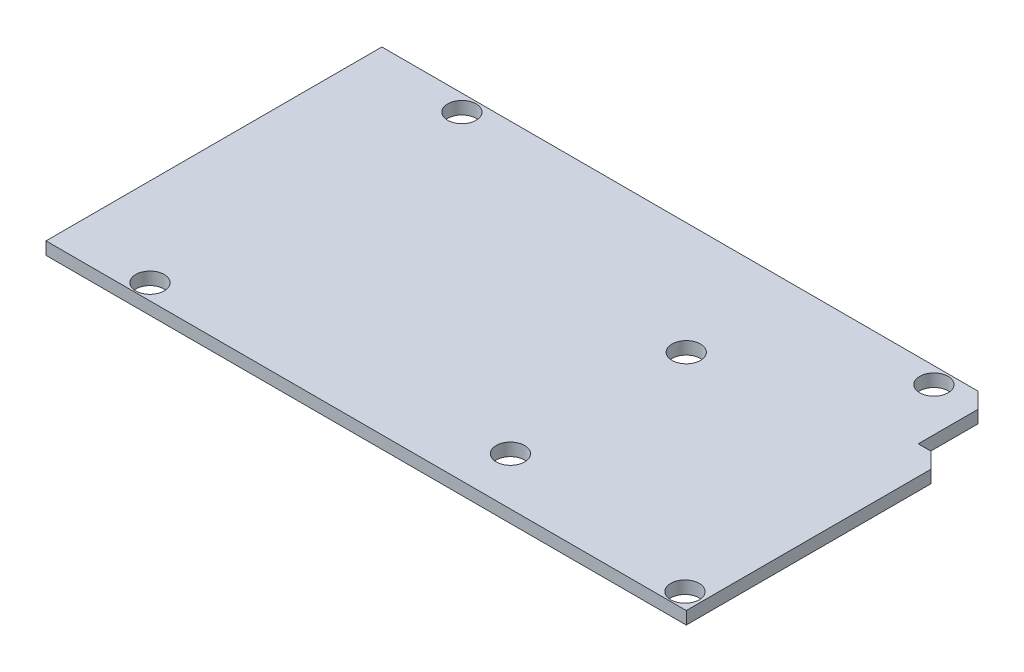
ISO-10303-21;
HEADER;
FILE_DESCRIPTION(('STEP AP214'),'2;1');
FILE_NAME('part.step','',(''),(''),'','','');
FILE_SCHEMA(('AUTOMOTIVE_DESIGN { 1 0 10303 214 1 1 1 1 }'));
ENDSEC;
DATA;
#1=APPLICATION_CONTEXT('core data for automotive mechanical design processes');
#2=APPLICATION_PROTOCOL_DEFINITION('international standard','automotive_design',2000,#1);
#3=PRODUCT_CONTEXT('',#1,'mechanical');
#4=PRODUCT('Part','Part','',(#3));
#5=PRODUCT_RELATED_PRODUCT_CATEGORY('part','',(#4));
#6=PRODUCT_DEFINITION_FORMATION('','',#4);
#7=PRODUCT_DEFINITION_CONTEXT('part definition',#1,'design');
#8=PRODUCT_DEFINITION('design','',#6,#7);
#9=PRODUCT_DEFINITION_SHAPE('','',#8);
#10=(LENGTH_UNIT() NAMED_UNIT(*) SI_UNIT(.MILLI.,.METRE.));
#11=(NAMED_UNIT(*) PLANE_ANGLE_UNIT() SI_UNIT($,.RADIAN.));
#12=(NAMED_UNIT(*) SI_UNIT($,.STERADIAN.) SOLID_ANGLE_UNIT());
#13=UNCERTAINTY_MEASURE_WITH_UNIT(LENGTH_MEASURE(1.E-05),#10,'distance_accuracy_value','');
#14=(GEOMETRIC_REPRESENTATION_CONTEXT(3) GLOBAL_UNCERTAINTY_ASSIGNED_CONTEXT((#13)) GLOBAL_UNIT_ASSIGNED_CONTEXT((#10,
#11,#12)) REPRESENTATION_CONTEXT('',''));
#15=CARTESIAN_POINT('',(0.,0.,0.));
#16=DIRECTION('',(0.,0.,1.));
#17=DIRECTION('',(1.,0.,0.));
#18=AXIS2_PLACEMENT_3D('',#15,#16,#17);
#19=CARTESIAN_POINT('',(-35.694341289752,2.,0.));
#20=DIRECTION('',(0.,0.,-1.));
#21=DIRECTION('',(-1.,0.,0.));
#22=AXIS2_PLACEMENT_3D('',#19,#20,#21);
#23=PLANE('',#22);
#24=DIRECTION('',(1.,0.,0.));
#25=VECTOR('',#24,1.);
#26=CARTESIAN_POINT('',(-35.694341289752,0.,0.));
#27=LINE('',#26,#25);
#28=CARTESIAN_POINT('',(-35.694341289752,0.,0.));
#29=VERTEX_POINT('',#28);
#30=CARTESIAN_POINT('',(65.905658710248,0.,0.));
#31=VERTEX_POINT('',#30);
#32=EDGE_CURVE('E132',#29,#31,#27,.T.);
#33=ORIENTED_EDGE('',*,*,#32,.T.);
#34=DIRECTION('',(0.,-1.,0.));
#35=VECTOR('',#34,1.);
#36=CARTESIAN_POINT('',(65.905658710248,2.,0.));
#37=LINE('',#36,#35);
#38=CARTESIAN_POINT('',(65.905658710248,2.,0.));
#39=VERTEX_POINT('',#38);
#40=EDGE_CURVE('E11',#39,#31,#37,.T.);
#41=ORIENTED_EDGE('',*,*,#40,.F.);
#42=DIRECTION('',(1.,0.,0.));
#43=VECTOR('',#42,1.);
#44=CARTESIAN_POINT('',(-35.694341289752,2.,0.));
#45=LINE('',#44,#43);
#46=CARTESIAN_POINT('',(-35.694341289752,2.,0.));
#47=VERTEX_POINT('',#46);
#48=EDGE_CURVE('E147',#47,#39,#45,.T.);
#49=ORIENTED_EDGE('',*,*,#48,.F.);
#50=DIRECTION('',(0.,-1.,0.));
#51=VECTOR('',#50,1.);
#52=CARTESIAN_POINT('',(-35.694341289752,2.,0.));
#53=LINE('',#52,#51);
#54=EDGE_CURVE('E128',#47,#29,#53,.T.);
#55=ORIENTED_EDGE('',*,*,#54,.T.);
#56=EDGE_LOOP('',(#33,#41,#49,#55));
#57=FACE_BOUND('',#56,.T.);
#58=ADVANCED_FACE('F34',(#57),#23,.F.);
#59=CARTESIAN_POINT('',(65.905658710248,2.,-38.8163495703502));
#60=DIRECTION('',(-1.,0.,0.));
#61=DIRECTION('',(0.,0.,1.));
#62=AXIS2_PLACEMENT_3D('',#59,#60,#61);
#63=PLANE('',#62);
#64=DIRECTION('',(0.,0.,-1.));
#65=VECTOR('',#64,1.);
#66=CARTESIAN_POINT('',(65.905658710248,0.,-38.8163495703502));
#67=LINE('',#66,#65);
#68=CARTESIAN_POINT('',(65.905658710248,0.,-38.8163495703502));
#69=VERTEX_POINT('',#68);
#70=EDGE_CURVE('E135',#31,#69,#67,.T.);
#71=ORIENTED_EDGE('',*,*,#70,.T.);
#72=DIRECTION('',(0.,-1.,0.));
#73=VECTOR('',#72,1.);
#74=CARTESIAN_POINT('',(65.905658710248,2.,-38.8163495703502));
#75=LINE('',#74,#73);
#76=CARTESIAN_POINT('',(65.905658710248,2.,-38.8163495703502));
#77=VERTEX_POINT('',#76);
#78=EDGE_CURVE('E43',#77,#69,#75,.T.);
#79=ORIENTED_EDGE('',*,*,#78,.F.);
#80=DIRECTION('',(0.,0.,-1.));
#81=VECTOR('',#80,1.);
#82=CARTESIAN_POINT('',(65.905658710248,2.,-38.8163495703502));
#83=LINE('',#82,#81);
#84=EDGE_CURVE('E95',#39,#77,#83,.T.);
#85=ORIENTED_EDGE('',*,*,#84,.F.);
#86=ORIENTED_EDGE('',*,*,#40,.T.);
#87=EDGE_LOOP('',(#71,#79,#85,#86));
#88=FACE_BOUND('',#87,.T.);
#89=ADVANCED_FACE('F228',(#88),#63,.F.);
#90=CARTESIAN_POINT('',(63.405658710248,2.,-41.3163495703502));
#91=DIRECTION('',(-0.707106781186547,0.,0.707106781186547));
#92=DIRECTION('',(0.707106781186548,0.,0.707106781186548));
#93=AXIS2_PLACEMENT_3D('',#90,#91,#92);
#94=PLANE('',#93);
#95=DIRECTION('',(-0.707106781186547,0.,-0.707106781186547));
#96=VECTOR('',#95,1.);
#97=CARTESIAN_POINT('',(63.405658710248,0.,-41.3163495703502));
#98=LINE('',#97,#96);
#99=CARTESIAN_POINT('',(63.405658710248,0.,-41.3163495703502));
#100=VERTEX_POINT('',#99);
#101=EDGE_CURVE('E138',#69,#100,#98,.T.);
#102=ORIENTED_EDGE('',*,*,#101,.T.);
#103=DIRECTION('',(0.,-1.,0.));
#104=VECTOR('',#103,1.);
#105=CARTESIAN_POINT('',(63.405658710248,2.,-41.3163495703502));
#106=LINE('',#105,#104);
#107=CARTESIAN_POINT('',(63.405658710248,2.,-41.3163495703502));
#108=VERTEX_POINT('',#107);
#109=EDGE_CURVE('E154',#108,#100,#106,.T.);
#110=ORIENTED_EDGE('',*,*,#109,.F.);
#111=DIRECTION('',(-0.707106781186547,0.,-0.707106781186547));
#112=VECTOR('',#111,1.);
#113=CARTESIAN_POINT('',(63.405658710248,2.,-41.3163495703502));
#114=LINE('',#113,#112);
#115=EDGE_CURVE('E196',#77,#108,#114,.T.);
#116=ORIENTED_EDGE('',*,*,#115,.F.);
#117=ORIENTED_EDGE('',*,*,#78,.T.);
#118=EDGE_LOOP('',(#102,#110,#116,#117));
#119=FACE_BOUND('',#118,.T.);
#120=ADVANCED_FACE('F232',(#119),#94,.F.);
#121=CARTESIAN_POINT('',(61.4018232297349,2.,-41.3163495703502));
#122=DIRECTION('',(0.,0.,1.));
#123=DIRECTION('',(1.,0.,0.));
#124=AXIS2_PLACEMENT_3D('',#121,#122,#123);
#125=PLANE('',#124);
#126=DIRECTION('',(-1.,0.,0.));
#127=VECTOR('',#126,1.);
#128=CARTESIAN_POINT('',(61.4018232297349,0.,-41.3163495703502));
#129=LINE('',#128,#127);
#130=CARTESIAN_POINT('',(61.4018232297349,0.,-41.3163495703502));
#131=VERTEX_POINT('',#130);
#132=EDGE_CURVE('E140',#100,#131,#129,.T.);
#133=ORIENTED_EDGE('',*,*,#132,.T.);
#134=DIRECTION('',(0.,-1.,0.));
#135=VECTOR('',#134,1.);
#136=CARTESIAN_POINT('',(61.4018232297349,2.,-41.3163495703502));
#137=LINE('',#136,#135);
#138=CARTESIAN_POINT('',(61.4018232297349,2.,-41.3163495703502));
#139=VERTEX_POINT('',#138);
#140=EDGE_CURVE('E151',#139,#131,#137,.T.);
#141=ORIENTED_EDGE('',*,*,#140,.F.);
#142=DIRECTION('',(-1.,0.,0.));
#143=VECTOR('',#142,1.);
#144=CARTESIAN_POINT('',(61.4018232297349,2.,-41.3163495703502));
#145=LINE('',#144,#143);
#146=EDGE_CURVE('E198',#108,#139,#145,.T.);
#147=ORIENTED_EDGE('',*,*,#146,.F.);
#148=ORIENTED_EDGE('',*,*,#109,.T.);
#149=EDGE_LOOP('',(#133,#141,#147,#148));
#150=FACE_BOUND('',#149,.T.);
#151=ADVANCED_FACE('F204',(#150),#125,.F.);
#152=CARTESIAN_POINT('',(61.4018232297349,2.,-50.8));
#153=DIRECTION('',(-1.,0.,0.));
#154=DIRECTION('',(0.,0.,1.));
#155=AXIS2_PLACEMENT_3D('',#152,#153,#154);
#156=PLANE('',#155);
#157=DIRECTION('',(0.,0.,-1.));
#158=VECTOR('',#157,1.);
#159=CARTESIAN_POINT('',(61.4018232297349,0.,-50.8));
#160=LINE('',#159,#158);
#161=CARTESIAN_POINT('',(61.4018232297349,0.,-50.8));
#162=VERTEX_POINT('',#161);
#163=EDGE_CURVE('E142',#131,#162,#160,.T.);
#164=ORIENTED_EDGE('',*,*,#163,.T.);
#165=DIRECTION('',(0.,-1.,0.));
#166=VECTOR('',#165,1.);
#167=CARTESIAN_POINT('',(61.4018232297349,2.,-50.8));
#168=LINE('',#167,#166);
#169=CARTESIAN_POINT('',(61.4018232297349,2.,-50.8));
#170=VERTEX_POINT('',#169);
#171=EDGE_CURVE('E123',#170,#162,#168,.T.);
#172=ORIENTED_EDGE('',*,*,#171,.F.);
#173=DIRECTION('',(0.,0.,-1.));
#174=VECTOR('',#173,1.);
#175=CARTESIAN_POINT('',(61.4018232297349,2.,-50.8));
#176=LINE('',#175,#174);
#177=EDGE_CURVE('E114',#139,#170,#176,.T.);
#178=ORIENTED_EDGE('',*,*,#177,.F.);
#179=ORIENTED_EDGE('',*,*,#140,.T.);
#180=EDGE_LOOP('',(#164,#172,#178,#179));
#181=FACE_BOUND('',#180,.T.);
#182=ADVANCED_FACE('F208',(#181),#156,.F.);
#183=CARTESIAN_POINT('',(58.9018232297349,2.,-53.3));
#184=DIRECTION('',(-0.707106781186547,0.,0.707106781186547));
#185=DIRECTION('',(0.707106781186548,0.,0.707106781186548));
#186=AXIS2_PLACEMENT_3D('',#183,#184,#185);
#187=PLANE('',#186);
#188=DIRECTION('',(-0.707106781186547,0.,-0.707106781186547));
#189=VECTOR('',#188,1.);
#190=CARTESIAN_POINT('',(58.9018232297349,0.,-53.3));
#191=LINE('',#190,#189);
#192=CARTESIAN_POINT('',(58.9018232297349,0.,-53.3));
#193=VERTEX_POINT('',#192);
#194=EDGE_CURVE('E122',#162,#193,#191,.T.);
#195=ORIENTED_EDGE('',*,*,#194,.T.);
#196=DIRECTION('',(0.,-1.,0.));
#197=VECTOR('',#196,1.);
#198=CARTESIAN_POINT('',(58.9018232297349,2.,-53.3));
#199=LINE('',#198,#197);
#200=CARTESIAN_POINT('',(58.9018232297349,2.,-53.3));
#201=VERTEX_POINT('',#200);
#202=EDGE_CURVE('E119',#201,#193,#199,.T.);
#203=ORIENTED_EDGE('',*,*,#202,.F.);
#204=DIRECTION('',(-0.707106781186547,0.,-0.707106781186547));
#205=VECTOR('',#204,1.);
#206=CARTESIAN_POINT('',(58.9018232297349,2.,-53.3));
#207=LINE('',#206,#205);
#208=EDGE_CURVE('E108',#170,#201,#207,.T.);
#209=ORIENTED_EDGE('',*,*,#208,.F.);
#210=ORIENTED_EDGE('',*,*,#171,.T.);
#211=EDGE_LOOP('',(#195,#203,#209,#210));
#212=FACE_BOUND('',#211,.T.);
#213=ADVANCED_FACE('F120',(#212),#187,.F.);
#214=CARTESIAN_POINT('',(-35.694341289752,2.,-53.3));
#215=DIRECTION('',(0.,0.,1.));
#216=DIRECTION('',(1.,0.,0.));
#217=AXIS2_PLACEMENT_3D('',#214,#215,#216);
#218=PLANE('',#217);
#219=DIRECTION('',(-1.,0.,0.));
#220=VECTOR('',#219,1.);
#221=CARTESIAN_POINT('',(-35.694341289752,0.,-53.3));
#222=LINE('',#221,#220);
#223=CARTESIAN_POINT('',(-35.694341289752,0.,-53.3));
#224=VERTEX_POINT('',#223);
#225=EDGE_CURVE('E81',#193,#224,#222,.T.);
#226=ORIENTED_EDGE('',*,*,#225,.T.);
#227=DIRECTION('',(0.,-1.,0.));
#228=VECTOR('',#227,1.);
#229=CARTESIAN_POINT('',(-35.694341289752,2.,-53.3));
#230=LINE('',#229,#228);
#231=CARTESIAN_POINT('',(-35.694341289752,2.,-53.3));
#232=VERTEX_POINT('',#231);
#233=EDGE_CURVE('E124',#232,#224,#230,.T.);
#234=ORIENTED_EDGE('',*,*,#233,.F.);
#235=DIRECTION('',(-1.,0.,0.));
#236=VECTOR('',#235,1.);
#237=CARTESIAN_POINT('',(-35.694341289752,2.,-53.3));
#238=LINE('',#237,#236);
#239=EDGE_CURVE('E112',#201,#232,#238,.T.);
#240=ORIENTED_EDGE('',*,*,#239,.F.);
#241=ORIENTED_EDGE('',*,*,#202,.T.);
#242=EDGE_LOOP('',(#226,#234,#240,#241));
#243=FACE_BOUND('',#242,.T.);
#244=ADVANCED_FACE('F126',(#243),#218,.F.);
#245=CARTESIAN_POINT('',(-35.694341289752,2.,0.));
#246=DIRECTION('',(1.,0.,0.));
#247=DIRECTION('',(0.,0.,-1.));
#248=AXIS2_PLACEMENT_3D('',#245,#246,#247);
#249=PLANE('',#248);
#250=DIRECTION('',(0.,0.,1.));
#251=VECTOR('',#250,1.);
#252=CARTESIAN_POINT('',(-35.694341289752,0.,0.));
#253=LINE('',#252,#251);
#254=EDGE_CURVE('E87',#224,#29,#253,.T.);
#255=ORIENTED_EDGE('',*,*,#254,.T.);
#256=ORIENTED_EDGE('',*,*,#54,.F.);
#257=DIRECTION('',(0.,0.,1.));
#258=VECTOR('',#257,1.);
#259=CARTESIAN_POINT('',(-35.694341289752,2.,0.));
#260=LINE('',#259,#258);
#261=EDGE_CURVE('E52',#232,#47,#260,.T.);
#262=ORIENTED_EDGE('',*,*,#261,.F.);
#263=ORIENTED_EDGE('',*,*,#233,.T.);
#264=EDGE_LOOP('',(#255,#256,#262,#263));
#265=FACE_BOUND('',#264,.T.);
#266=ADVANCED_FACE('F216',(#265),#249,.F.);
#267=CARTESIAN_POINT('',(65.905658710248,2.,0.));
#268=DIRECTION('',(0.,-1.,0.));
#269=DIRECTION('',(0.,0.,-1.));
#270=AXIS2_PLACEMENT_3D('',#267,#268,#269);
#271=PLANE('',#270);
#272=CARTESIAN_POINT('',(63.2012999111424,2.,-2.5));
#273=DIRECTION('',(0.,1.,0.));
#274=DIRECTION('',(0.,0.,1.));
#275=AXIS2_PLACEMENT_3D('',#272,#273,#274);
#276=CIRCLE('',#275,2.261);
#277=CARTESIAN_POINT('',(63.2012999111424,2.,-0.239000000000004));
#278=VERTEX_POINT('',#277);
#279=EDGE_CURVE('E185',#278,#278,#276,.T.);
#280=ORIENTED_EDGE('',*,*,#279,.F.);
#281=EDGE_LOOP('',(#280));
#282=FACE_BOUND('',#281,.T.);
#283=CARTESIAN_POINT('',(54.505658710248,2.,-50.7));
#284=DIRECTION('',(0.,1.,0.));
#285=DIRECTION('',(0.,0.,1.));
#286=AXIS2_PLACEMENT_3D('',#283,#284,#285);
#287=CIRCLE('',#286,2.261);
#288=CARTESIAN_POINT('',(54.505658710248,2.,-48.439));
#289=VERTEX_POINT('',#288);
#290=EDGE_CURVE('E175',#289,#289,#287,.T.);
#291=ORIENTED_EDGE('',*,*,#290,.F.);
#292=EDGE_LOOP('',(#291));
#293=FACE_BOUND('',#292,.T.);
#294=CARTESIAN_POINT('',(30.405658710248,2.,-35.5));
#295=DIRECTION('',(0.,1.,0.));
#296=DIRECTION('',(0.,0.,1.));
#297=AXIS2_PLACEMENT_3D('',#294,#295,#296);
#298=CIRCLE('',#297,2.261);
#299=CARTESIAN_POINT('',(30.405658710248,2.,-33.239));
#300=VERTEX_POINT('',#299);
#301=EDGE_CURVE('E172',#300,#300,#298,.T.);
#302=ORIENTED_EDGE('',*,*,#301,.F.);
#303=EDGE_LOOP('',(#302));
#304=FACE_BOUND('',#303,.T.);
#305=CARTESIAN_POINT('',(30.405658710248,2.,-7.6));
#306=DIRECTION('',(0.,1.,0.));
#307=DIRECTION('',(0.,0.,1.));
#308=AXIS2_PLACEMENT_3D('',#305,#306,#307);
#309=CIRCLE('',#308,2.261);
#310=CARTESIAN_POINT('',(30.405658710248,2.,-5.339));
#311=VERTEX_POINT('',#310);
#312=EDGE_CURVE('E169',#311,#311,#309,.T.);
#313=ORIENTED_EDGE('',*,*,#312,.F.);
#314=EDGE_LOOP('',(#313));
#315=FACE_BOUND('',#314,.T.);
#316=CARTESIAN_POINT('',(-21.694341289752,2.,-2.5));
#317=DIRECTION('',(0.,1.,0.));
#318=DIRECTION('',(0.,0.,1.));
#319=AXIS2_PLACEMENT_3D('',#316,#317,#318);
#320=CIRCLE('',#319,2.261);
#321=CARTESIAN_POINT('',(-21.694341289752,2.,-0.239));
#322=VERTEX_POINT('',#321);
#323=EDGE_CURVE('E165',#322,#322,#320,.T.);
#324=ORIENTED_EDGE('',*,*,#323,.F.);
#325=EDGE_LOOP('',(#324));
#326=FACE_BOUND('',#325,.T.);
#327=CARTESIAN_POINT('',(-20.394341289752,2.,-50.7));
#328=DIRECTION('',(0.,1.,0.));
#329=DIRECTION('',(0.,0.,1.));
#330=AXIS2_PLACEMENT_3D('',#327,#328,#329);
#331=CIRCLE('',#330,2.261);
#332=CARTESIAN_POINT('',(-20.394341289752,2.,-48.439));
#333=VERTEX_POINT('',#332);
#334=EDGE_CURVE('E161',#333,#333,#331,.T.);
#335=ORIENTED_EDGE('',*,*,#334,.F.);
#336=EDGE_LOOP('',(#335));
#337=FACE_BOUND('',#336,.T.);
#338=ORIENTED_EDGE('',*,*,#48,.T.);
#339=ORIENTED_EDGE('',*,*,#84,.T.);
#340=ORIENTED_EDGE('',*,*,#115,.T.);
#341=ORIENTED_EDGE('',*,*,#146,.T.);
#342=ORIENTED_EDGE('',*,*,#177,.T.);
#343=ORIENTED_EDGE('',*,*,#208,.T.);
#344=ORIENTED_EDGE('',*,*,#239,.T.);
#345=ORIENTED_EDGE('',*,*,#261,.T.);
#346=EDGE_LOOP('',(#338,#339,#340,#341,#342,#343,#344,#345));
#347=FACE_BOUND('',#346,.T.);
#348=ADVANCED_FACE('F110',(#282,#293,#304,#315,#326,#337,#347),#271,.F.);
#349=CARTESIAN_POINT('',(65.905658710248,0.,0.));
#350=DIRECTION('',(0.,-1.,0.));
#351=DIRECTION('',(0.,0.,-1.));
#352=AXIS2_PLACEMENT_3D('',#349,#350,#351);
#353=PLANE('',#352);
#354=CARTESIAN_POINT('',(63.2012999111424,0.,-2.5));
#355=DIRECTION('',(0.,-1.,0.));
#356=DIRECTION('',(0.,0.,-1.));
#357=AXIS2_PLACEMENT_3D('',#354,#355,#356);
#358=CIRCLE('',#357,2.261);
#359=CARTESIAN_POINT('',(63.2012999111424,0.,-4.761));
#360=VERTEX_POINT('',#359);
#361=EDGE_CURVE('E37',#360,#360,#358,.T.);
#362=ORIENTED_EDGE('',*,*,#361,.F.);
#363=EDGE_LOOP('',(#362));
#364=FACE_BOUND('',#363,.T.);
#365=CARTESIAN_POINT('',(54.505658710248,0.,-50.7));
#366=DIRECTION('',(0.,-1.,0.));
#367=DIRECTION('',(0.,0.,-1.));
#368=AXIS2_PLACEMENT_3D('',#365,#366,#367);
#369=CIRCLE('',#368,2.261);
#370=CARTESIAN_POINT('',(54.505658710248,0.,-52.961));
#371=VERTEX_POINT('',#370);
#372=EDGE_CURVE('E173',#371,#371,#369,.T.);
#373=ORIENTED_EDGE('',*,*,#372,.F.);
#374=EDGE_LOOP('',(#373));
#375=FACE_BOUND('',#374,.T.);
#376=CARTESIAN_POINT('',(30.405658710248,0.,-35.5));
#377=DIRECTION('',(0.,-1.,0.));
#378=DIRECTION('',(0.,0.,-1.));
#379=AXIS2_PLACEMENT_3D('',#376,#377,#378);
#380=CIRCLE('',#379,2.261);
#381=CARTESIAN_POINT('',(30.405658710248,0.,-37.761));
#382=VERTEX_POINT('',#381);
#383=EDGE_CURVE('E170',#382,#382,#380,.T.);
#384=ORIENTED_EDGE('',*,*,#383,.F.);
#385=EDGE_LOOP('',(#384));
#386=FACE_BOUND('',#385,.T.);
#387=CARTESIAN_POINT('',(30.405658710248,0.,-7.6));
#388=DIRECTION('',(0.,-1.,0.));
#389=DIRECTION('',(0.,0.,-1.));
#390=AXIS2_PLACEMENT_3D('',#387,#388,#389);
#391=CIRCLE('',#390,2.261);
#392=CARTESIAN_POINT('',(30.405658710248,0.,-9.861));
#393=VERTEX_POINT('',#392);
#394=EDGE_CURVE('E166',#393,#393,#391,.T.);
#395=ORIENTED_EDGE('',*,*,#394,.F.);
#396=EDGE_LOOP('',(#395));
#397=FACE_BOUND('',#396,.T.);
#398=CARTESIAN_POINT('',(-21.694341289752,0.,-2.5));
#399=DIRECTION('',(0.,-1.,0.));
#400=DIRECTION('',(0.,0.,-1.));
#401=AXIS2_PLACEMENT_3D('',#398,#399,#400);
#402=CIRCLE('',#401,2.261);
#403=CARTESIAN_POINT('',(-21.694341289752,0.,-4.761));
#404=VERTEX_POINT('',#403);
#405=EDGE_CURVE('E162',#404,#404,#402,.T.);
#406=ORIENTED_EDGE('',*,*,#405,.F.);
#407=EDGE_LOOP('',(#406));
#408=FACE_BOUND('',#407,.T.);
#409=CARTESIAN_POINT('',(-20.394341289752,0.,-50.7));
#410=DIRECTION('',(0.,-1.,0.));
#411=DIRECTION('',(0.,0.,-1.));
#412=AXIS2_PLACEMENT_3D('',#409,#410,#411);
#413=CIRCLE('',#412,2.261);
#414=CARTESIAN_POINT('',(-20.394341289752,0.,-52.961));
#415=VERTEX_POINT('',#414);
#416=EDGE_CURVE('E136',#415,#415,#413,.T.);
#417=ORIENTED_EDGE('',*,*,#416,.F.);
#418=EDGE_LOOP('',(#417));
#419=FACE_BOUND('',#418,.T.);
#420=ORIENTED_EDGE('',*,*,#32,.F.);
#421=ORIENTED_EDGE('',*,*,#254,.F.);
#422=ORIENTED_EDGE('',*,*,#225,.F.);
#423=ORIENTED_EDGE('',*,*,#194,.F.);
#424=ORIENTED_EDGE('',*,*,#163,.F.);
#425=ORIENTED_EDGE('',*,*,#132,.F.);
#426=ORIENTED_EDGE('',*,*,#101,.F.);
#427=ORIENTED_EDGE('',*,*,#70,.F.);
#428=EDGE_LOOP('',(#420,#421,#422,#423,#424,#425,#426,#427));
#429=FACE_BOUND('',#428,.T.);
#430=ADVANCED_FACE('F211',(#364,#375,#386,#397,#408,#419,#429),#353,.T.);
#431=CARTESIAN_POINT('',(-20.394341289752,-2.,-50.7));
#432=DIRECTION('',(0.,1.,0.));
#433=DIRECTION('',(0.,0.,1.));
#434=AXIS2_PLACEMENT_3D('',#431,#432,#433);
#435=CYLINDRICAL_SURFACE('',#434,2.261);
#436=ORIENTED_EDGE('',*,*,#416,.T.);
#437=EDGE_LOOP('',(#436));
#438=FACE_BOUND('',#437,.T.);
#439=ORIENTED_EDGE('',*,*,#334,.T.);
#440=EDGE_LOOP('',(#439));
#441=FACE_BOUND('',#440,.T.);
#442=ADVANCED_FACE('F262',(#438,#441),#435,.F.);
#443=CARTESIAN_POINT('',(-21.694341289752,-2.,-2.5));
#444=DIRECTION('',(0.,1.,0.));
#445=DIRECTION('',(0.,0.,1.));
#446=AXIS2_PLACEMENT_3D('',#443,#444,#445);
#447=CYLINDRICAL_SURFACE('',#446,2.261);
#448=ORIENTED_EDGE('',*,*,#405,.T.);
#449=EDGE_LOOP('',(#448));
#450=FACE_BOUND('',#449,.T.);
#451=ORIENTED_EDGE('',*,*,#323,.T.);
#452=EDGE_LOOP('',(#451));
#453=FACE_BOUND('',#452,.T.);
#454=ADVANCED_FACE('F267',(#450,#453),#447,.F.);
#455=CARTESIAN_POINT('',(30.405658710248,-2.,-7.6));
#456=DIRECTION('',(0.,1.,0.));
#457=DIRECTION('',(0.,0.,1.));
#458=AXIS2_PLACEMENT_3D('',#455,#456,#457);
#459=CYLINDRICAL_SURFACE('',#458,2.261);
#460=ORIENTED_EDGE('',*,*,#394,.T.);
#461=EDGE_LOOP('',(#460));
#462=FACE_BOUND('',#461,.T.);
#463=ORIENTED_EDGE('',*,*,#312,.T.);
#464=EDGE_LOOP('',(#463));
#465=FACE_BOUND('',#464,.T.);
#466=ADVANCED_FACE('F290',(#462,#465),#459,.F.);
#467=CARTESIAN_POINT('',(30.405658710248,-2.,-35.5));
#468=DIRECTION('',(0.,1.,0.));
#469=DIRECTION('',(0.,0.,1.));
#470=AXIS2_PLACEMENT_3D('',#467,#468,#469);
#471=CYLINDRICAL_SURFACE('',#470,2.261);
#472=ORIENTED_EDGE('',*,*,#383,.T.);
#473=EDGE_LOOP('',(#472));
#474=FACE_BOUND('',#473,.T.);
#475=ORIENTED_EDGE('',*,*,#301,.T.);
#476=EDGE_LOOP('',(#475));
#477=FACE_BOUND('',#476,.T.);
#478=ADVANCED_FACE('F300',(#474,#477),#471,.F.);
#479=CARTESIAN_POINT('',(54.505658710248,-2.,-50.7));
#480=DIRECTION('',(0.,1.,0.));
#481=DIRECTION('',(0.,0.,1.));
#482=AXIS2_PLACEMENT_3D('',#479,#480,#481);
#483=CYLINDRICAL_SURFACE('',#482,2.261);
#484=ORIENTED_EDGE('',*,*,#372,.T.);
#485=EDGE_LOOP('',(#484));
#486=FACE_BOUND('',#485,.T.);
#487=ORIENTED_EDGE('',*,*,#290,.T.);
#488=EDGE_LOOP('',(#487));
#489=FACE_BOUND('',#488,.T.);
#490=ADVANCED_FACE('F310',(#486,#489),#483,.F.);
#491=CARTESIAN_POINT('',(63.2012999111424,-2.,-2.5));
#492=DIRECTION('',(0.,1.,0.));
#493=DIRECTION('',(0.,0.,1.));
#494=AXIS2_PLACEMENT_3D('',#491,#492,#493);
#495=CYLINDRICAL_SURFACE('',#494,2.261);
#496=ORIENTED_EDGE('',*,*,#361,.T.);
#497=EDGE_LOOP('',(#496));
#498=FACE_BOUND('',#497,.T.);
#499=ORIENTED_EDGE('',*,*,#279,.T.);
#500=EDGE_LOOP('',(#499));
#501=FACE_BOUND('',#500,.T.);
#502=ADVANCED_FACE('F320',(#498,#501),#495,.F.);
#503=CLOSED_SHELL('',(#58,#89,#120,#151,#182,#213,#244,#266,#348,#430,#442,#454,#466,#478,#490,#502));
#504=MANIFOLD_SOLID_BREP('B2',#503);
#505=ADVANCED_BREP_SHAPE_REPRESENTATION('',(#18,#504),#14);
#506=SHAPE_DEFINITION_REPRESENTATION(#9,#505);
ENDSEC;
END-ISO-10303-21;
